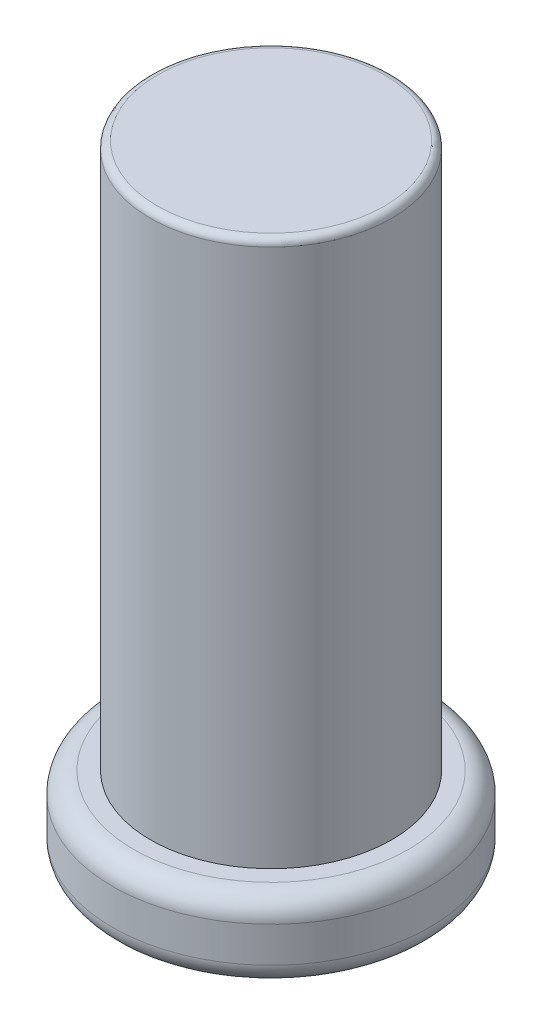
ISO-10303-21;
HEADER;
FILE_DESCRIPTION(('STEP AP214'),'2;1');
FILE_NAME('part.step','',(''),(''),'','','');
FILE_SCHEMA(('AUTOMOTIVE_DESIGN { 1 0 10303 214 1 1 1 1 }'));
ENDSEC;
DATA;
#1=APPLICATION_CONTEXT('core data for automotive mechanical design processes');
#2=APPLICATION_PROTOCOL_DEFINITION('international standard','automotive_design',2000,#1);
#3=PRODUCT_CONTEXT('',#1,'mechanical');
#4=PRODUCT('Part','Part','',(#3));
#5=PRODUCT_RELATED_PRODUCT_CATEGORY('part','',(#4));
#6=PRODUCT_DEFINITION_FORMATION('','',#4);
#7=PRODUCT_DEFINITION_CONTEXT('part definition',#1,'design');
#8=PRODUCT_DEFINITION('design','',#6,#7);
#9=PRODUCT_DEFINITION_SHAPE('','',#8);
#10=(LENGTH_UNIT() NAMED_UNIT(*) SI_UNIT(.MILLI.,.METRE.));
#11=(NAMED_UNIT(*) PLANE_ANGLE_UNIT() SI_UNIT($,.RADIAN.));
#12=(NAMED_UNIT(*) SI_UNIT($,.STERADIAN.) SOLID_ANGLE_UNIT());
#13=UNCERTAINTY_MEASURE_WITH_UNIT(LENGTH_MEASURE(1.E-05),#10,'distance_accuracy_value','');
#14=(GEOMETRIC_REPRESENTATION_CONTEXT(3) GLOBAL_UNCERTAINTY_ASSIGNED_CONTEXT((#13)) GLOBAL_UNIT_ASSIGNED_CONTEXT((#10,
#11,#12)) REPRESENTATION_CONTEXT('',''));
#15=CARTESIAN_POINT('',(0.,0.,0.));
#16=DIRECTION('',(0.,0.,1.));
#17=DIRECTION('',(1.,0.,0.));
#18=AXIS2_PLACEMENT_3D('',#15,#16,#17);
#19=CARTESIAN_POINT('',(0.,76.85,0.));
#20=DIRECTION('',(0.,1.,0.));
#21=DIRECTION('',(-1.,0.,0.));
#22=AXIS2_PLACEMENT_3D('',#19,#20,#21);
#23=CYLINDRICAL_SURFACE('',#22,17.);
#24=CARTESIAN_POINT('',(0.,75.85,0.));
#25=DIRECTION('',(0.,1.,0.));
#26=DIRECTION('',(-1.,0.,0.));
#27=AXIS2_PLACEMENT_3D('',#24,#25,#26);
#28=CIRCLE('',#27,17.);
#29=CARTESIAN_POINT('',(-17.,75.85,0.));
#30=VERTEX_POINT('',#29);
#31=EDGE_CURVE('E10',#30,#30,#28,.F.);
#32=ORIENTED_EDGE('',*,*,#31,.T.);
#33=EDGE_LOOP('',(#32));
#34=FACE_BOUND('',#33,.T.);
#35=CARTESIAN_POINT('',(0.,0.,0.));
#36=DIRECTION('',(0.,1.,0.));
#37=DIRECTION('',(-1.,0.,0.));
#38=AXIS2_PLACEMENT_3D('',#35,#36,#37);
#39=CIRCLE('',#38,17.);
#40=CARTESIAN_POINT('',(-17.,0.,0.));
#41=VERTEX_POINT('',#40);
#42=EDGE_CURVE('E62',#41,#41,#39,.T.);
#43=ORIENTED_EDGE('',*,*,#42,.T.);
#44=EDGE_LOOP('',(#43));
#45=FACE_BOUND('',#44,.T.);
#46=ADVANCED_FACE('F36',(#34,#45),#23,.T.);
#47=CARTESIAN_POINT('',(0.,0.,0.));
#48=DIRECTION('',(0.,1.,0.));
#49=DIRECTION('',(-1.,0.,0.));
#50=AXIS2_PLACEMENT_3D('',#47,#48,#49);
#51=PLANE('',#50);
#52=CARTESIAN_POINT('',(0.,0.,0.));
#53=DIRECTION('',(0.,1.,0.));
#54=DIRECTION('',(-1.,0.,0.));
#55=AXIS2_PLACEMENT_3D('',#52,#53,#54);
#56=CIRCLE('',#55,19.35);
#57=CARTESIAN_POINT('',(-19.35,0.,0.));
#58=VERTEX_POINT('',#57);
#59=EDGE_CURVE('E47',#58,#58,#56,.T.);
#60=ORIENTED_EDGE('',*,*,#59,.T.);
#61=EDGE_LOOP('',(#60));
#62=FACE_BOUND('',#61,.T.);
#63=ORIENTED_EDGE('',*,*,#42,.F.);
#64=EDGE_LOOP('',(#63));
#65=FACE_BOUND('',#64,.T.);
#66=ADVANCED_FACE('F67',(#62,#65),#51,.T.);
#67=CARTESIAN_POINT('',(0.,76.85,0.));
#68=DIRECTION('',(0.,1.,0.));
#69=DIRECTION('',(-1.,0.,0.));
#70=AXIS2_PLACEMENT_3D('',#67,#68,#69);
#71=CYLINDRICAL_SURFACE('',#70,22.35);
#72=CARTESIAN_POINT('',(0.,-8.00000000000001,0.));
#73=DIRECTION('',(0.,1.,0.));
#74=DIRECTION('',(-1.,0.,0.));
#75=AXIS2_PLACEMENT_3D('',#72,#73,#74);
#76=CIRCLE('',#75,22.35);
#77=CARTESIAN_POINT('',(-22.35,-8.00000000000001,0.));
#78=VERTEX_POINT('',#77);
#79=EDGE_CURVE('E56',#78,#78,#76,.T.);
#80=ORIENTED_EDGE('',*,*,#79,.T.);
#81=EDGE_LOOP('',(#80));
#82=FACE_BOUND('',#81,.T.);
#83=CARTESIAN_POINT('',(0.,-3.,0.));
#84=DIRECTION('',(0.,1.,0.));
#85=DIRECTION('',(-1.,0.,0.));
#86=AXIS2_PLACEMENT_3D('',#83,#84,#85);
#87=CIRCLE('',#86,22.35);
#88=CARTESIAN_POINT('',(-22.35,-3.,0.));
#89=VERTEX_POINT('',#88);
#90=EDGE_CURVE('E59',#89,#89,#87,.F.);
#91=ORIENTED_EDGE('',*,*,#90,.T.);
#92=EDGE_LOOP('',(#91));
#93=FACE_BOUND('',#92,.T.);
#94=ADVANCED_FACE('F69',(#82,#93),#71,.T.);
#95=CARTESIAN_POINT('',(0.,-11.,0.));
#96=DIRECTION('',(0.,1.,0.));
#97=DIRECTION('',(-1.,0.,0.));
#98=AXIS2_PLACEMENT_3D('',#95,#96,#97);
#99=PLANE('',#98);
#100=CARTESIAN_POINT('',(0.,-11.,0.));
#101=DIRECTION('',(0.,1.,0.));
#102=DIRECTION('',(-1.,0.,0.));
#103=AXIS2_PLACEMENT_3D('',#100,#101,#102);
#104=CIRCLE('',#103,19.35);
#105=CARTESIAN_POINT('',(-19.35,-11.,0.));
#106=VERTEX_POINT('',#105);
#107=EDGE_CURVE('E51',#106,#106,#104,.F.);
#108=ORIENTED_EDGE('',*,*,#107,.T.);
#109=EDGE_LOOP('',(#108));
#110=FACE_BOUND('',#109,.T.);
#111=ADVANCED_FACE('F76',(#110),#99,.F.);
#112=CARTESIAN_POINT('',(0.,76.85,0.));
#113=DIRECTION('',(0.,1.,0.));
#114=DIRECTION('',(-1.,0.,0.));
#115=AXIS2_PLACEMENT_3D('',#112,#113,#114);
#116=PLANE('',#115);
#117=CARTESIAN_POINT('',(0.,76.85,0.));
#118=DIRECTION('',(0.,1.,0.));
#119=DIRECTION('',(-1.,0.,0.));
#120=AXIS2_PLACEMENT_3D('',#117,#118,#119);
#121=CIRCLE('',#120,16.);
#122=CARTESIAN_POINT('',(-16.,76.85,0.));
#123=VERTEX_POINT('',#122);
#124=EDGE_CURVE('E43',#123,#123,#121,.T.);
#125=ORIENTED_EDGE('',*,*,#124,.T.);
#126=EDGE_LOOP('',(#125));
#127=FACE_BOUND('',#126,.T.);
#128=ADVANCED_FACE('F85',(#127),#116,.T.);
#129=CARTESIAN_POINT('',(0.,-8.00000000000001,0.));
#130=DIRECTION('',(0.,1.,0.));
#131=DIRECTION('',(-1.,0.,0.));
#132=AXIS2_PLACEMENT_3D('',#129,#130,#131);
#133=TOROIDAL_SURFACE('',#132,19.35,3.);
#134=ORIENTED_EDGE('',*,*,#107,.F.);
#135=EDGE_LOOP('',(#134));
#136=FACE_BOUND('',#135,.T.);
#137=ORIENTED_EDGE('',*,*,#79,.F.);
#138=EDGE_LOOP('',(#137));
#139=FACE_BOUND('',#138,.T.);
#140=ADVANCED_FACE('F82',(#136,#139),#133,.T.);
#141=CARTESIAN_POINT('',(0.,-3.,0.));
#142=DIRECTION('',(0.,1.,0.));
#143=DIRECTION('',(-1.,0.,0.));
#144=AXIS2_PLACEMENT_3D('',#141,#142,#143);
#145=TOROIDAL_SURFACE('',#144,19.35,3.);
#146=ORIENTED_EDGE('',*,*,#90,.F.);
#147=EDGE_LOOP('',(#146));
#148=FACE_BOUND('',#147,.T.);
#149=ORIENTED_EDGE('',*,*,#59,.F.);
#150=EDGE_LOOP('',(#149));
#151=FACE_BOUND('',#150,.T.);
#152=ADVANCED_FACE('F84',(#148,#151),#145,.T.);
#153=CARTESIAN_POINT('',(0.,75.85,0.));
#154=DIRECTION('',(0.,1.,0.));
#155=DIRECTION('',(-1.,0.,0.));
#156=AXIS2_PLACEMENT_3D('',#153,#154,#155);
#157=TOROIDAL_SURFACE('',#156,16.,1.);
#158=ORIENTED_EDGE('',*,*,#31,.F.);
#159=EDGE_LOOP('',(#158));
#160=FACE_BOUND('',#159,.T.);
#161=ORIENTED_EDGE('',*,*,#124,.F.);
#162=EDGE_LOOP('',(#161));
#163=FACE_BOUND('',#162,.T.);
#164=ADVANCED_FACE('F38',(#160,#163),#157,.T.);
#165=CLOSED_SHELL('',(#46,#66,#94,#111,#128,#140,#152,#164));
#166=MANIFOLD_SOLID_BREP('B2',#165);
#167=ADVANCED_BREP_SHAPE_REPRESENTATION('',(#18,#166),#14);
#168=SHAPE_DEFINITION_REPRESENTATION(#9,#167);
ENDSEC;
END-ISO-10303-21;
